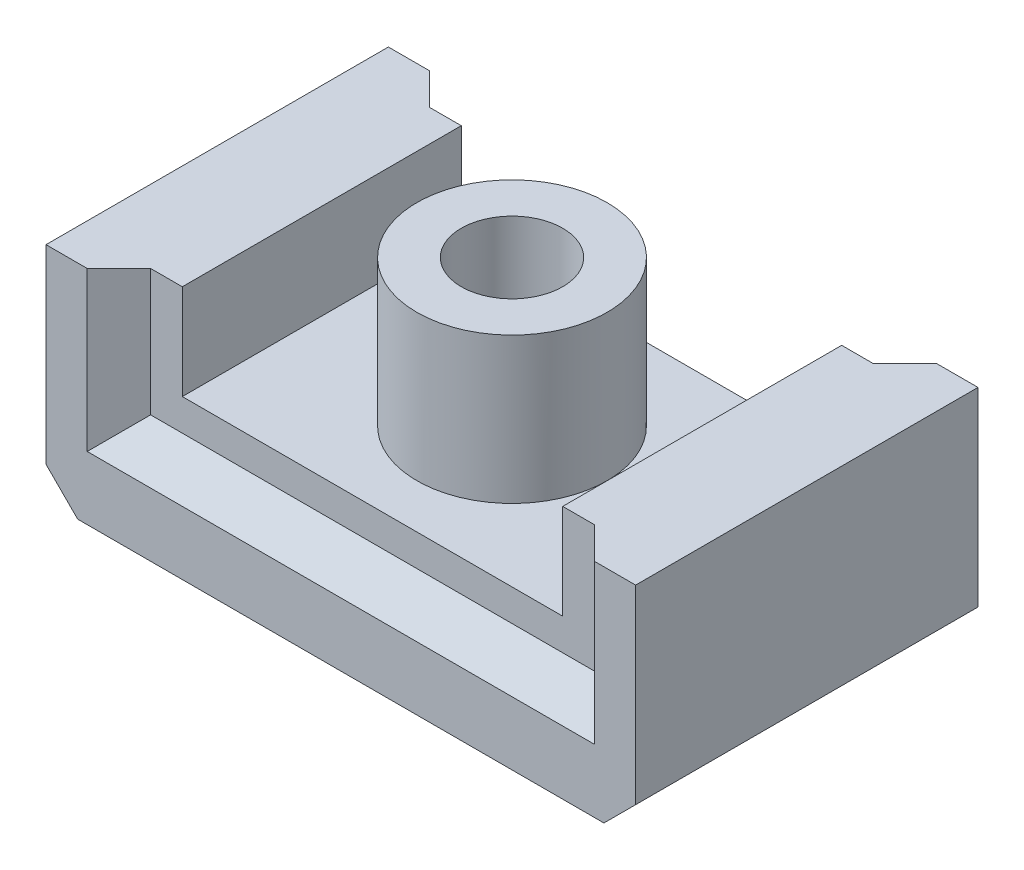
ISO-10303-21;
HEADER;
FILE_DESCRIPTION(('STEP AP214'),'2;1');
FILE_NAME('part.step','',(''),(''),'','','');
FILE_SCHEMA(('AUTOMOTIVE_DESIGN { 1 0 10303 214 1 1 1 1 }'));
ENDSEC;
DATA;
#1=APPLICATION_CONTEXT('core data for automotive mechanical design processes');
#2=APPLICATION_PROTOCOL_DEFINITION('international standard','automotive_design',2000,#1);
#3=PRODUCT_CONTEXT('',#1,'mechanical');
#4=PRODUCT('Part','Part','',(#3));
#5=PRODUCT_RELATED_PRODUCT_CATEGORY('part','',(#4));
#6=PRODUCT_DEFINITION_FORMATION('','',#4);
#7=PRODUCT_DEFINITION_CONTEXT('part definition',#1,'design');
#8=PRODUCT_DEFINITION('design','',#6,#7);
#9=PRODUCT_DEFINITION_SHAPE('','',#8);
#10=(LENGTH_UNIT() NAMED_UNIT(*) SI_UNIT(.MILLI.,.METRE.));
#11=(NAMED_UNIT(*) PLANE_ANGLE_UNIT() SI_UNIT($,.RADIAN.));
#12=(NAMED_UNIT(*) SI_UNIT($,.STERADIAN.) SOLID_ANGLE_UNIT());
#13=UNCERTAINTY_MEASURE_WITH_UNIT(LENGTH_MEASURE(1.E-05),#10,'distance_accuracy_value','');
#14=(GEOMETRIC_REPRESENTATION_CONTEXT(3) GLOBAL_UNCERTAINTY_ASSIGNED_CONTEXT((#13)) GLOBAL_UNIT_ASSIGNED_CONTEXT((#10,
#11,#12)) REPRESENTATION_CONTEXT('',''));
#15=CARTESIAN_POINT('',(0.,0.,0.));
#16=DIRECTION('',(0.,0.,1.));
#17=DIRECTION('',(1.,0.,0.));
#18=AXIS2_PLACEMENT_3D('',#15,#16,#17);
#19=CARTESIAN_POINT('',(15.3,7.,10.8));
#20=DIRECTION('',(1.,0.,0.));
#21=DIRECTION('',(0.,0.,-1.));
#22=AXIS2_PLACEMENT_3D('',#19,#20,#21);
#23=PLANE('',#22);
#24=DIRECTION('',(0.,-1.,0.));
#25=VECTOR('',#24,1.);
#26=CARTESIAN_POINT('',(15.3,7.,9.8));
#27=LINE('',#26,#25);
#28=CARTESIAN_POINT('',(15.3,7.,9.8));
#29=VERTEX_POINT('',#28);
#30=CARTESIAN_POINT('',(15.3,4.,9.8));
#31=VERTEX_POINT('',#30);
#32=EDGE_CURVE('E193',#29,#31,#27,.T.);
#33=ORIENTED_EDGE('',*,*,#32,.F.);
#34=DIRECTION('',(0.,0.,-1.));
#35=VECTOR('',#34,1.);
#36=CARTESIAN_POINT('',(15.3,7.,10.8));
#37=LINE('',#36,#35);
#38=CARTESIAN_POINT('',(15.3,7.,1.));
#39=VERTEX_POINT('',#38);
#40=EDGE_CURVE('E258',#29,#39,#37,.T.);
#41=ORIENTED_EDGE('',*,*,#40,.T.);
#42=DIRECTION('',(0.,1.,0.));
#43=VECTOR('',#42,1.);
#44=CARTESIAN_POINT('',(15.3,7.,1.));
#45=LINE('',#44,#43);
#46=CARTESIAN_POINT('',(15.3,4.,1.));
#47=VERTEX_POINT('',#46);
#48=EDGE_CURVE('E216',#47,#39,#45,.T.);
#49=ORIENTED_EDGE('',*,*,#48,.F.);
#50=DIRECTION('',(0.,0.,-1.));
#51=VECTOR('',#50,1.);
#52=CARTESIAN_POINT('',(15.3,4.,10.8));
#53=LINE('',#52,#51);
#54=EDGE_CURVE('E256',#31,#47,#53,.T.);
#55=ORIENTED_EDGE('',*,*,#54,.F.);
#56=EDGE_LOOP('',(#33,#41,#49,#55));
#57=FACE_BOUND('',#56,.T.);
#58=ADVANCED_FACE('F33',(#57),#23,.F.);
#59=CARTESIAN_POINT('',(15.3,4.,10.8));
#60=DIRECTION('',(0.,-1.,0.));
#61=DIRECTION('',(0.,0.,-1.));
#62=AXIS2_PLACEMENT_3D('',#59,#60,#61);
#63=PLANE('',#62);
#64=CARTESIAN_POINT('',(9.3,4.,5.4));
#65=DIRECTION('',(0.,-1.,0.));
#66=DIRECTION('',(0.,0.,-1.));
#67=AXIS2_PLACEMENT_3D('',#64,#65,#66);
#68=CIRCLE('',#67,3.);
#69=CARTESIAN_POINT('',(9.3,4.,2.4));
#70=VERTEX_POINT('',#69);
#71=EDGE_CURVE('E262',#70,#70,#68,.F.);
#72=ORIENTED_EDGE('',*,*,#71,.F.);
#73=EDGE_LOOP('',(#72));
#74=FACE_BOUND('',#73,.T.);
#75=DIRECTION('',(-1.,0.,0.));
#76=VECTOR('',#75,1.);
#77=CARTESIAN_POINT('',(15.3,4.,9.8));
#78=LINE('',#77,#76);
#79=CARTESIAN_POINT('',(3.3,4.,9.8));
#80=VERTEX_POINT('',#79);
#81=EDGE_CURVE('E191',#31,#80,#78,.T.);
#82=ORIENTED_EDGE('',*,*,#81,.F.);
#83=ORIENTED_EDGE('',*,*,#54,.T.);
#84=DIRECTION('',(1.,0.,0.));
#85=VECTOR('',#84,1.);
#86=CARTESIAN_POINT('',(15.3,4.,1.));
#87=LINE('',#86,#85);
#88=CARTESIAN_POINT('',(3.3,4.,1.));
#89=VERTEX_POINT('',#88);
#90=EDGE_CURVE('E213',#89,#47,#87,.T.);
#91=ORIENTED_EDGE('',*,*,#90,.F.);
#92=DIRECTION('',(0.,0.,-1.));
#93=VECTOR('',#92,1.);
#94=CARTESIAN_POINT('',(3.3,4.,10.8));
#95=LINE('',#94,#93);
#96=EDGE_CURVE('E254',#80,#89,#95,.T.);
#97=ORIENTED_EDGE('',*,*,#96,.F.);
#98=EDGE_LOOP('',(#82,#83,#91,#97));
#99=FACE_BOUND('',#98,.T.);
#100=ADVANCED_FACE('F362',(#74,#99),#63,.F.);
#101=CARTESIAN_POINT('',(3.3,4.,10.8));
#102=DIRECTION('',(-1.,0.,0.));
#103=DIRECTION('',(0.,0.,1.));
#104=AXIS2_PLACEMENT_3D('',#101,#102,#103);
#105=PLANE('',#104);
#106=DIRECTION('',(0.,1.,0.));
#107=VECTOR('',#106,1.);
#108=CARTESIAN_POINT('',(3.3,4.,9.8));
#109=LINE('',#108,#107);
#110=CARTESIAN_POINT('',(3.3,7.,9.8));
#111=VERTEX_POINT('',#110);
#112=EDGE_CURVE('E188',#80,#111,#109,.T.);
#113=ORIENTED_EDGE('',*,*,#112,.F.);
#114=ORIENTED_EDGE('',*,*,#96,.T.);
#115=DIRECTION('',(0.,-1.,0.));
#116=VECTOR('',#115,1.);
#117=CARTESIAN_POINT('',(3.3,4.,1.));
#118=LINE('',#117,#116);
#119=CARTESIAN_POINT('',(3.3,7.,1.));
#120=VERTEX_POINT('',#119);
#121=EDGE_CURVE('E199',#120,#89,#118,.T.);
#122=ORIENTED_EDGE('',*,*,#121,.F.);
#123=DIRECTION('',(0.,0.,-1.));
#124=VECTOR('',#123,1.);
#125=CARTESIAN_POINT('',(3.3,7.,10.8));
#126=LINE('',#125,#124);
#127=EDGE_CURVE('E252',#111,#120,#126,.T.);
#128=ORIENTED_EDGE('',*,*,#127,.F.);
#129=EDGE_LOOP('',(#113,#114,#122,#128));
#130=FACE_BOUND('',#129,.T.);
#131=ADVANCED_FACE('F366',(#130),#105,.F.);
#132=CARTESIAN_POINT('',(18.6,7.,10.8));
#133=DIRECTION('',(0.,-1.,0.));
#134=DIRECTION('',(0.,0.,-1.));
#135=AXIS2_PLACEMENT_3D('',#132,#133,#134);
#136=PLANE('',#135);
#137=DIRECTION('',(1.,0.,0.));
#138=VECTOR('',#137,1.);
#139=CARTESIAN_POINT('',(17.3,7.,9.8));
#140=LINE('',#139,#138);
#141=CARTESIAN_POINT('',(16.3,7.,9.8));
#142=VERTEX_POINT('',#141);
#143=EDGE_CURVE('E164',#29,#142,#140,.T.);
#144=ORIENTED_EDGE('',*,*,#143,.T.);
#145=DIRECTION('',(-0.707106781186551,0.,-0.707106781186544));
#146=VECTOR('',#145,1.);
#147=CARTESIAN_POINT('',(17.95,7.,11.45));
#148=LINE('',#147,#146);
#149=CARTESIAN_POINT('',(17.3,7.,10.8));
#150=VERTEX_POINT('',#149);
#151=EDGE_CURVE('E11',#142,#150,#148,.F.);
#152=ORIENTED_EDGE('',*,*,#151,.T.);
#153=DIRECTION('',(-1.,0.,0.));
#154=VECTOR('',#153,1.);
#155=CARTESIAN_POINT('',(18.6,7.,10.8));
#156=LINE('',#155,#154);
#157=CARTESIAN_POINT('',(18.6,7.,10.8));
#158=VERTEX_POINT('',#157);
#159=EDGE_CURVE('E162',#158,#150,#156,.T.);
#160=ORIENTED_EDGE('',*,*,#159,.F.);
#161=DIRECTION('',(0.,0.,-1.));
#162=VECTOR('',#161,1.);
#163=CARTESIAN_POINT('',(18.6,7.,10.8));
#164=LINE('',#163,#162);
#165=CARTESIAN_POINT('',(18.6,7.,0.));
#166=VERTEX_POINT('',#165);
#167=EDGE_CURVE('E260',#158,#166,#164,.T.);
#168=ORIENTED_EDGE('',*,*,#167,.T.);
#169=DIRECTION('',(-1.,0.,0.));
#170=VECTOR('',#169,1.);
#171=CARTESIAN_POINT('',(18.6,7.,0.));
#172=LINE('',#171,#170);
#173=CARTESIAN_POINT('',(17.3,7.,0.));
#174=VERTEX_POINT('',#173);
#175=EDGE_CURVE('E246',#166,#174,#172,.T.);
#176=ORIENTED_EDGE('',*,*,#175,.T.);
#177=DIRECTION('',(-0.707106781186551,0.,0.707106781186544));
#178=VECTOR('',#177,1.);
#179=CARTESIAN_POINT('',(12.55,7.,4.74999999999995));
#180=LINE('',#179,#178);
#181=CARTESIAN_POINT('',(16.3,7.,1.));
#182=VERTEX_POINT('',#181);
#183=EDGE_CURVE('E292',#174,#182,#180,.T.);
#184=ORIENTED_EDGE('',*,*,#183,.T.);
#185=DIRECTION('',(1.,0.,0.));
#186=VECTOR('',#185,1.);
#187=CARTESIAN_POINT('',(17.3,7.,1.));
#188=LINE('',#187,#186);
#189=EDGE_CURVE('E200',#39,#182,#188,.T.);
#190=ORIENTED_EDGE('',*,*,#189,.F.);
#191=ORIENTED_EDGE('',*,*,#40,.F.);
#192=EDGE_LOOP('',(#144,#152,#160,#168,#176,#184,#190,#191));
#193=FACE_BOUND('',#192,.T.);
#194=ADVANCED_FACE('F160',(#193),#136,.F.);
#195=CARTESIAN_POINT('',(3.3,7.,10.8));
#196=DIRECTION('',(0.,-1.,0.));
#197=DIRECTION('',(0.,0.,-1.));
#198=AXIS2_PLACEMENT_3D('',#195,#196,#197);
#199=PLANE('',#198);
#200=DIRECTION('',(-1.,0.,0.));
#201=VECTOR('',#200,1.);
#202=CARTESIAN_POINT('',(3.3,7.,10.8));
#203=LINE('',#202,#201);
#204=CARTESIAN_POINT('',(1.3,7.,10.8));
#205=VERTEX_POINT('',#204);
#206=CARTESIAN_POINT('',(0.,7.,10.8));
#207=VERTEX_POINT('',#206);
#208=EDGE_CURVE('E174',#205,#207,#203,.T.);
#209=ORIENTED_EDGE('',*,*,#208,.F.);
#210=DIRECTION('',(-0.707106781186551,0.,0.707106781186544));
#211=VECTOR('',#210,1.);
#212=CARTESIAN_POINT('',(2.30000000000001,7.,9.8));
#213=LINE('',#212,#211);
#214=CARTESIAN_POINT('',(2.30000000000001,7.,9.8));
#215=VERTEX_POINT('',#214);
#216=EDGE_CURVE('E42',#205,#215,#213,.F.);
#217=ORIENTED_EDGE('',*,*,#216,.T.);
#218=EDGE_CURVE('E185',#215,#111,#140,.T.);
#219=ORIENTED_EDGE('',*,*,#218,.T.);
#220=ORIENTED_EDGE('',*,*,#127,.T.);
#221=CARTESIAN_POINT('',(2.30000000000001,7.,1.));
#222=VERTEX_POINT('',#221);
#223=EDGE_CURVE('E196',#222,#120,#188,.T.);
#224=ORIENTED_EDGE('',*,*,#223,.F.);
#225=DIRECTION('',(-0.707106781186551,0.,-0.707106781186544));
#226=VECTOR('',#225,1.);
#227=CARTESIAN_POINT('',(7.70000000000001,7.,6.39999999999995));
#228=LINE('',#227,#226);
#229=CARTESIAN_POINT('',(1.3,7.,0.));
#230=VERTEX_POINT('',#229);
#231=EDGE_CURVE('E290',#222,#230,#228,.T.);
#232=ORIENTED_EDGE('',*,*,#231,.T.);
#233=DIRECTION('',(-1.,0.,0.));
#234=VECTOR('',#233,1.);
#235=CARTESIAN_POINT('',(3.3,7.,0.));
#236=LINE('',#235,#234);
#237=CARTESIAN_POINT('',(0.,7.,0.));
#238=VERTEX_POINT('',#237);
#239=EDGE_CURVE('E233',#230,#238,#236,.T.);
#240=ORIENTED_EDGE('',*,*,#239,.T.);
#241=DIRECTION('',(0.,0.,-1.));
#242=VECTOR('',#241,1.);
#243=CARTESIAN_POINT('',(0.,7.,10.8));
#244=LINE('',#243,#242);
#245=EDGE_CURVE('E238',#207,#238,#244,.T.);
#246=ORIENTED_EDGE('',*,*,#245,.F.);
#247=EDGE_LOOP('',(#209,#217,#219,#220,#224,#232,#240,#246));
#248=FACE_BOUND('',#247,.T.);
#249=ADVANCED_FACE('F312',(#248),#199,.F.);
#250=CARTESIAN_POINT('',(0.,0.,10.8));
#251=DIRECTION('',(0.,0.,1.));
#252=DIRECTION('',(1.,0.,0.));
#253=AXIS2_PLACEMENT_3D('',#250,#251,#252);
#254=PLANE('',#253);
#255=ORIENTED_EDGE('',*,*,#159,.T.);
#256=DIRECTION('',(0.,-1.,0.));
#257=VECTOR('',#256,1.);
#258=CARTESIAN_POINT('',(17.3,7.,10.8));
#259=LINE('',#258,#257);
#260=CARTESIAN_POINT('',(17.3,2.,10.8));
#261=VERTEX_POINT('',#260);
#262=EDGE_CURVE('E169',#150,#261,#259,.T.);
#263=ORIENTED_EDGE('',*,*,#262,.T.);
#264=DIRECTION('',(-1.,0.,0.));
#265=VECTOR('',#264,1.);
#266=CARTESIAN_POINT('',(17.3,2.,10.8));
#267=LINE('',#266,#265);
#268=CARTESIAN_POINT('',(1.3,2.,10.8));
#269=VERTEX_POINT('',#268);
#270=EDGE_CURVE('E181',#261,#269,#267,.T.);
#271=ORIENTED_EDGE('',*,*,#270,.T.);
#272=DIRECTION('',(0.,1.,0.));
#273=VECTOR('',#272,1.);
#274=CARTESIAN_POINT('',(1.3,7.,10.8));
#275=LINE('',#274,#273);
#276=EDGE_CURVE('E178',#269,#205,#275,.T.);
#277=ORIENTED_EDGE('',*,*,#276,.T.);
#278=ORIENTED_EDGE('',*,*,#208,.T.);
#279=DIRECTION('',(0.,-1.,0.));
#280=VECTOR('',#279,1.);
#281=CARTESIAN_POINT('',(0.,7.,10.8));
#282=LINE('',#281,#280);
#283=CARTESIAN_POINT('',(0.,1.00000000000001,10.8));
#284=VERTEX_POINT('',#283);
#285=EDGE_CURVE('E229',#207,#284,#282,.T.);
#286=ORIENTED_EDGE('',*,*,#285,.T.);
#287=DIRECTION('',(-0.707106781186546,0.707106781186549,0.));
#288=VECTOR('',#287,1.);
#289=CARTESIAN_POINT('',(0.500000000000004,0.500000000000002,10.8));
#290=LINE('',#289,#288);
#291=CARTESIAN_POINT('',(1.,0.,10.8));
#292=VERTEX_POINT('',#291);
#293=EDGE_CURVE('E278',#284,#292,#290,.F.);
#294=ORIENTED_EDGE('',*,*,#293,.T.);
#295=DIRECTION('',(1.,0.,0.));
#296=VECTOR('',#295,1.);
#297=CARTESIAN_POINT('',(0.,0.,10.8));
#298=LINE('',#297,#296);
#299=CARTESIAN_POINT('',(17.6,0.,10.8));
#300=VERTEX_POINT('',#299);
#301=EDGE_CURVE('E232',#292,#300,#298,.T.);
#302=ORIENTED_EDGE('',*,*,#301,.T.);
#303=DIRECTION('',(-0.707106781186551,-0.707106781186544,0.));
#304=VECTOR('',#303,1.);
#305=CARTESIAN_POINT('',(8.7999999999999,-8.8,10.8));
#306=LINE('',#305,#304);
#307=CARTESIAN_POINT('',(18.6,0.999999999999996,10.8));
#308=VERTEX_POINT('',#307);
#309=EDGE_CURVE('E276',#300,#308,#306,.F.);
#310=ORIENTED_EDGE('',*,*,#309,.T.);
#311=DIRECTION('',(0.,1.,0.));
#312=VECTOR('',#311,1.);
#313=CARTESIAN_POINT('',(18.6,0.,10.8));
#314=LINE('',#313,#312);
#315=EDGE_CURVE('E172',#308,#158,#314,.T.);
#316=ORIENTED_EDGE('',*,*,#315,.T.);
#317=EDGE_LOOP('',(#255,#263,#271,#277,#278,#286,#294,#302,#310,#316));
#318=FACE_BOUND('',#317,.T.);
#319=ADVANCED_FACE('F168',(#318),#254,.T.);
#320=CARTESIAN_POINT('',(0.,7.,10.8));
#321=DIRECTION('',(1.,0.,0.));
#322=DIRECTION('',(0.,1.,0.));
#323=AXIS2_PLACEMENT_3D('',#320,#321,#322);
#324=PLANE('',#323);
#325=DIRECTION('',(0.,-1.,0.));
#326=VECTOR('',#325,1.);
#327=CARTESIAN_POINT('',(0.,7.,0.));
#328=LINE('',#327,#326);
#329=CARTESIAN_POINT('',(0.,1.00000000000001,0.));
#330=VERTEX_POINT('',#329);
#331=EDGE_CURVE('E228',#238,#330,#328,.T.);
#332=ORIENTED_EDGE('',*,*,#331,.T.);
#333=DIRECTION('',(0.,0.,1.));
#334=VECTOR('',#333,1.);
#335=CARTESIAN_POINT('',(0.,1.00000000000001,10.8));
#336=LINE('',#335,#334);
#337=EDGE_CURVE('E274',#330,#284,#336,.T.);
#338=ORIENTED_EDGE('',*,*,#337,.T.);
#339=ORIENTED_EDGE('',*,*,#285,.F.);
#340=ORIENTED_EDGE('',*,*,#245,.T.);
#341=EDGE_LOOP('',(#332,#338,#339,#340));
#342=FACE_BOUND('',#341,.T.);
#343=ADVANCED_FACE('F317',(#342),#324,.F.);
#344=CARTESIAN_POINT('',(0.,0.,10.8));
#345=DIRECTION('',(0.,1.,0.));
#346=DIRECTION('',(0.,0.,1.));
#347=AXIS2_PLACEMENT_3D('',#344,#345,#346);
#348=PLANE('',#347);
#349=CARTESIAN_POINT('',(9.3,0.,5.4));
#350=DIRECTION('',(0.,1.,0.));
#351=DIRECTION('',(0.,0.,1.));
#352=AXIS2_PLACEMENT_3D('',#349,#350,#351);
#353=CIRCLE('',#352,1.6);
#354=CARTESIAN_POINT('',(9.3,0.,7.));
#355=VERTEX_POINT('',#354);
#356=EDGE_CURVE('E220',#355,#355,#353,.T.);
#357=ORIENTED_EDGE('',*,*,#356,.T.);
#358=EDGE_LOOP('',(#357));
#359=FACE_BOUND('',#358,.T.);
#360=ORIENTED_EDGE('',*,*,#301,.F.);
#361=DIRECTION('',(0.,0.,-1.));
#362=VECTOR('',#361,1.);
#363=CARTESIAN_POINT('',(1.,0.,10.8));
#364=LINE('',#363,#362);
#365=CARTESIAN_POINT('',(1.,0.,0.));
#366=VERTEX_POINT('',#365);
#367=EDGE_CURVE('E267',#292,#366,#364,.T.);
#368=ORIENTED_EDGE('',*,*,#367,.T.);
#369=DIRECTION('',(1.,0.,0.));
#370=VECTOR('',#369,1.);
#371=CARTESIAN_POINT('',(0.,0.,0.));
#372=LINE('',#371,#370);
#373=CARTESIAN_POINT('',(17.6,0.,0.));
#374=VERTEX_POINT('',#373);
#375=EDGE_CURVE('E241',#366,#374,#372,.T.);
#376=ORIENTED_EDGE('',*,*,#375,.T.);
#377=DIRECTION('',(0.,0.,1.));
#378=VECTOR('',#377,1.);
#379=CARTESIAN_POINT('',(17.6,0.,10.8));
#380=LINE('',#379,#378);
#381=EDGE_CURVE('E265',#374,#300,#380,.T.);
#382=ORIENTED_EDGE('',*,*,#381,.T.);
#383=EDGE_LOOP('',(#360,#368,#376,#382));
#384=FACE_BOUND('',#383,.T.);
#385=ADVANCED_FACE('F326',(#359,#384),#348,.F.);
#386=CARTESIAN_POINT('',(18.6,0.,10.8));
#387=DIRECTION('',(-1.,0.,0.));
#388=DIRECTION('',(0.,-1.,0.));
#389=AXIS2_PLACEMENT_3D('',#386,#387,#388);
#390=PLANE('',#389);
#391=ORIENTED_EDGE('',*,*,#315,.F.);
#392=DIRECTION('',(0.,0.,-1.));
#393=VECTOR('',#392,1.);
#394=CARTESIAN_POINT('',(18.6,0.999999999999996,10.8));
#395=LINE('',#394,#393);
#396=CARTESIAN_POINT('',(18.6,0.999999999999996,0.));
#397=VERTEX_POINT('',#396);
#398=EDGE_CURVE('E280',#308,#397,#395,.T.);
#399=ORIENTED_EDGE('',*,*,#398,.T.);
#400=DIRECTION('',(0.,1.,0.));
#401=VECTOR('',#400,1.);
#402=CARTESIAN_POINT('',(18.6,0.,0.));
#403=LINE('',#402,#401);
#404=EDGE_CURVE('E244',#397,#166,#403,.T.);
#405=ORIENTED_EDGE('',*,*,#404,.T.);
#406=ORIENTED_EDGE('',*,*,#167,.F.);
#407=EDGE_LOOP('',(#391,#399,#405,#406));
#408=FACE_BOUND('',#407,.T.);
#409=ADVANCED_FACE('F337',(#408),#390,.F.);
#410=CARTESIAN_POINT('',(0.,0.,0.));
#411=DIRECTION('',(0.,0.,1.));
#412=DIRECTION('',(1.,0.,0.));
#413=AXIS2_PLACEMENT_3D('',#410,#411,#412);
#414=PLANE('',#413);
#415=DIRECTION('',(-1.,0.,0.));
#416=VECTOR('',#415,1.);
#417=CARTESIAN_POINT('',(17.3,2.,0.));
#418=LINE('',#417,#416);
#419=CARTESIAN_POINT('',(17.3,2.,0.));
#420=VERTEX_POINT('',#419);
#421=CARTESIAN_POINT('',(1.3,2.,0.));
#422=VERTEX_POINT('',#421);
#423=EDGE_CURVE('E204',#420,#422,#418,.T.);
#424=ORIENTED_EDGE('',*,*,#423,.F.);
#425=DIRECTION('',(0.,-1.,0.));
#426=VECTOR('',#425,1.);
#427=CARTESIAN_POINT('',(17.3,7.,0.));
#428=LINE('',#427,#426);
#429=EDGE_CURVE('E201',#174,#420,#428,.T.);
#430=ORIENTED_EDGE('',*,*,#429,.F.);
#431=ORIENTED_EDGE('',*,*,#175,.F.);
#432=ORIENTED_EDGE('',*,*,#404,.F.);
#433=DIRECTION('',(0.707106781186551,0.707106781186544,0.));
#434=VECTOR('',#433,1.);
#435=CARTESIAN_POINT('',(18.6,0.999999999999997,0.));
#436=LINE('',#435,#434);
#437=EDGE_CURVE('E270',#397,#374,#436,.F.);
#438=ORIENTED_EDGE('',*,*,#437,.T.);
#439=ORIENTED_EDGE('',*,*,#375,.F.);
#440=DIRECTION('',(0.707106781186546,-0.707106781186549,0.));
#441=VECTOR('',#440,1.);
#442=CARTESIAN_POINT('',(1.,0.,0.));
#443=LINE('',#442,#441);
#444=EDGE_CURVE('E272',#366,#330,#443,.F.);
#445=ORIENTED_EDGE('',*,*,#444,.T.);
#446=ORIENTED_EDGE('',*,*,#331,.F.);
#447=ORIENTED_EDGE('',*,*,#239,.F.);
#448=DIRECTION('',(0.,1.,0.));
#449=VECTOR('',#448,1.);
#450=CARTESIAN_POINT('',(1.3,7.,0.));
#451=LINE('',#450,#449);
#452=EDGE_CURVE('E208',#422,#230,#451,.T.);
#453=ORIENTED_EDGE('',*,*,#452,.F.);
#454=EDGE_LOOP('',(#424,#430,#431,#432,#438,#439,#445,#446,#447,#453));
#455=FACE_BOUND('',#454,.T.);
#456=ADVANCED_FACE('F329',(#455),#414,.F.);
#457=CARTESIAN_POINT('',(9.3,8.6,5.4));
#458=DIRECTION('',(0.,-1.,0.));
#459=DIRECTION('',(0.,0.,-1.));
#460=AXIS2_PLACEMENT_3D('',#457,#458,#459);
#461=CYLINDRICAL_SURFACE('',#460,3.);
#462=CARTESIAN_POINT('',(9.3,8.6,5.4));
#463=DIRECTION('',(0.,1.,0.));
#464=DIRECTION('',(0.,0.,1.));
#465=AXIS2_PLACEMENT_3D('',#462,#463,#464);
#466=CIRCLE('',#465,3.);
#467=CARTESIAN_POINT('',(9.3,8.6,8.4));
#468=VERTEX_POINT('',#467);
#469=EDGE_CURVE('E223',#468,#468,#466,.T.);
#470=ORIENTED_EDGE('',*,*,#469,.F.);
#471=EDGE_LOOP('',(#470));
#472=FACE_BOUND('',#471,.T.);
#473=ORIENTED_EDGE('',*,*,#71,.T.);
#474=EDGE_LOOP('',(#473));
#475=FACE_BOUND('',#474,.T.);
#476=ADVANCED_FACE('F415',(#472,#475),#461,.T.);
#477=CARTESIAN_POINT('',(9.3,8.6,5.4));
#478=DIRECTION('',(0.,1.,0.));
#479=DIRECTION('',(0.,0.,1.));
#480=AXIS2_PLACEMENT_3D('',#477,#478,#479);
#481=PLANE('',#480);
#482=CARTESIAN_POINT('',(9.3,8.6,5.4));
#483=DIRECTION('',(0.,1.,0.));
#484=DIRECTION('',(0.,0.,1.));
#485=AXIS2_PLACEMENT_3D('',#482,#483,#484);
#486=CIRCLE('',#485,1.6);
#487=CARTESIAN_POINT('',(9.3,8.6,7.));
#488=VERTEX_POINT('',#487);
#489=EDGE_CURVE('E219',#488,#488,#486,.T.);
#490=ORIENTED_EDGE('',*,*,#489,.F.);
#491=EDGE_LOOP('',(#490));
#492=FACE_BOUND('',#491,.T.);
#493=ORIENTED_EDGE('',*,*,#469,.T.);
#494=EDGE_LOOP('',(#493));
#495=FACE_BOUND('',#494,.T.);
#496=ADVANCED_FACE('F411',(#492,#495),#481,.T.);
#497=CARTESIAN_POINT('',(9.3,0.,5.4));
#498=DIRECTION('',(0.,1.,0.));
#499=DIRECTION('',(0.,0.,1.));
#500=AXIS2_PLACEMENT_3D('',#497,#498,#499);
#501=CYLINDRICAL_SURFACE('',#500,1.6);
#502=CARTESIAN_POINT('',(9.3,0.,7.));
#503=CARTESIAN_POINT('',(9.3,0.0895833333333332,7.));
#504=CARTESIAN_POINT('',(9.3,0.179166666666667,7.));
#505=CARTESIAN_POINT('',(9.3,0.358333333333333,7.));
#506=CARTESIAN_POINT('',(9.3,0.447916666666667,7.));
#507=CARTESIAN_POINT('',(9.3,0.627083333333333,7.));
#508=CARTESIAN_POINT('',(9.3,0.716666666666667,7.));
#509=CARTESIAN_POINT('',(9.3,0.895833333333333,7.));
#510=CARTESIAN_POINT('',(9.3,0.985416666666667,7.));
#511=CARTESIAN_POINT('',(9.3,1.16458333333333,7.));
#512=CARTESIAN_POINT('',(9.3,1.25416666666667,7.));
#513=CARTESIAN_POINT('',(9.3,1.43333333333333,7.));
#514=CARTESIAN_POINT('',(9.3,1.52291666666667,7.));
#515=CARTESIAN_POINT('',(9.3,1.70208333333333,7.));
#516=CARTESIAN_POINT('',(9.3,1.79166666666667,7.));
#517=CARTESIAN_POINT('',(9.3,1.97083333333333,7.));
#518=CARTESIAN_POINT('',(9.3,2.06041666666667,7.));
#519=CARTESIAN_POINT('',(9.3,2.23958333333333,7.));
#520=CARTESIAN_POINT('',(9.3,2.32916666666667,7.));
#521=CARTESIAN_POINT('',(9.3,2.50833333333333,7.));
#522=CARTESIAN_POINT('',(9.3,2.59791666666667,7.));
#523=CARTESIAN_POINT('',(9.3,2.77708333333333,7.));
#524=CARTESIAN_POINT('',(9.3,2.86666666666667,7.));
#525=CARTESIAN_POINT('',(9.3,3.04583333333333,7.));
#526=CARTESIAN_POINT('',(9.3,3.13541666666667,7.));
#527=CARTESIAN_POINT('',(9.3,3.31458333333333,7.));
#528=CARTESIAN_POINT('',(9.3,3.40416666666667,7.));
#529=CARTESIAN_POINT('',(9.3,3.58333333333333,7.));
#530=CARTESIAN_POINT('',(9.3,3.67291666666667,7.));
#531=CARTESIAN_POINT('',(9.3,3.85208333333333,7.));
#532=CARTESIAN_POINT('',(9.3,3.94166666666667,7.));
#533=CARTESIAN_POINT('',(9.3,4.12083333333333,7.));
#534=CARTESIAN_POINT('',(9.3,4.21041666666667,7.));
#535=CARTESIAN_POINT('',(9.3,4.38958333333333,7.));
#536=CARTESIAN_POINT('',(9.3,4.47916666666667,7.));
#537=CARTESIAN_POINT('',(9.3,4.65833333333333,7.));
#538=CARTESIAN_POINT('',(9.3,4.74791666666667,7.));
#539=CARTESIAN_POINT('',(9.3,4.92708333333333,7.));
#540=CARTESIAN_POINT('',(9.3,5.01666666666667,7.));
#541=CARTESIAN_POINT('',(9.3,5.19583333333333,7.));
#542=CARTESIAN_POINT('',(9.3,5.28541666666667,7.));
#543=CARTESIAN_POINT('',(9.3,5.46458333333333,7.));
#544=CARTESIAN_POINT('',(9.3,5.55416666666667,7.));
#545=CARTESIAN_POINT('',(9.3,5.73333333333333,7.));
#546=CARTESIAN_POINT('',(9.3,5.82291666666667,7.));
#547=CARTESIAN_POINT('',(9.3,6.00208333333333,7.));
#548=CARTESIAN_POINT('',(9.3,6.09166666666667,7.));
#549=CARTESIAN_POINT('',(9.3,6.27083333333333,7.));
#550=CARTESIAN_POINT('',(9.3,6.36041666666667,7.));
#551=CARTESIAN_POINT('',(9.3,6.53958333333333,7.));
#552=CARTESIAN_POINT('',(9.3,6.62916666666667,7.));
#553=CARTESIAN_POINT('',(9.3,6.80833333333333,7.));
#554=CARTESIAN_POINT('',(9.3,6.89791666666667,7.));
#555=CARTESIAN_POINT('',(9.3,7.07708333333333,7.));
#556=CARTESIAN_POINT('',(9.3,7.16666666666667,7.));
#557=CARTESIAN_POINT('',(9.3,7.34583333333333,7.));
#558=CARTESIAN_POINT('',(9.3,7.43541666666667,7.));
#559=CARTESIAN_POINT('',(9.3,7.61458333333333,7.));
#560=CARTESIAN_POINT('',(9.3,7.70416666666667,7.));
#561=CARTESIAN_POINT('',(9.3,7.88333333333333,7.));
#562=CARTESIAN_POINT('',(9.3,7.97291666666667,7.));
#563=CARTESIAN_POINT('',(9.3,8.15208333333333,7.));
#564=CARTESIAN_POINT('',(9.3,8.24166666666667,7.));
#565=CARTESIAN_POINT('',(9.3,8.42083333333333,7.));
#566=CARTESIAN_POINT('',(9.3,8.51041666666666,7.));
#567=CARTESIAN_POINT('',(9.3,8.6,7.));
#568=B_SPLINE_CURVE_WITH_KNOTS('',3,(#502,#503,#504,#505,#506,#507,#508,#509,#510,#511,#512,
#513,#514,#515,#516,#517,#518,#519,#520,#521,#522,#523,#524,#525,#526,#527,#528,#529,#530,#531,
#532,#533,#534,#535,#536,#537,#538,#539,#540,#541,#542,#543,#544,#545,#546,#547,#548,#549,#550,
#551,#552,#553,#554,#555,#556,#557,#558,#559,#560,#561,#562,#563,#564,#565,#566,#567),
.UNSPECIFIED.,.F.,.F.,(4,2,2,2,2,2,2,2,2,2,2,2,2,2,2,2,2,2,2,2,2,2,2,2,2,2,2,2,2,2,2,2,4),(0.,
0.26875,0.5375,0.80625,1.075,1.34375,1.6125,1.88125,2.15,2.41875,2.6875,2.95625,3.225,3.49375,
3.7625,4.03125,4.3,4.56875,4.8375,5.10625,5.375,5.64375,5.9125,6.18125,6.45,6.71875,6.9875,
7.25625,7.525,7.79375,8.0625,8.33125,8.6),.UNSPECIFIED.);
#569=EDGE_CURVE('BSEAM398',#355,#488,#568,.T.);
#570=ORIENTED_EDGE('',*,*,#356,.F.);
#571=ORIENTED_EDGE('',*,*,#489,.T.);
#572=ORIENTED_EDGE('',*,*,#569,.T.);
#573=ORIENTED_EDGE('',*,*,#569,.F.);
#574=EDGE_LOOP('',(#570,#572,#571,#573));
#575=FACE_BOUND('',#574,.T.);
#576=ADVANCED_FACE('F398',(#575),#501,.F.);
#577=CARTESIAN_POINT('',(1.,0.,10.8));
#578=DIRECTION('',(0.707106781186549,0.707106781186546,0.));
#579=DIRECTION('',(0.,0.,-1.));
#580=AXIS2_PLACEMENT_3D('',#577,#578,#579);
#581=PLANE('',#580);
#582=ORIENTED_EDGE('',*,*,#293,.F.);
#583=ORIENTED_EDGE('',*,*,#337,.F.);
#584=ORIENTED_EDGE('',*,*,#444,.F.);
#585=ORIENTED_EDGE('',*,*,#367,.F.);
#586=EDGE_LOOP('',(#582,#583,#584,#585));
#587=FACE_BOUND('',#586,.T.);
#588=ADVANCED_FACE('F323',(#587),#581,.F.);
#589=CARTESIAN_POINT('',(18.6,0.999999999999997,10.8));
#590=DIRECTION('',(-0.707106781186544,0.707106781186552,0.));
#591=DIRECTION('',(0.,0.,-1.));
#592=AXIS2_PLACEMENT_3D('',#589,#590,#591);
#593=PLANE('',#592);
#594=ORIENTED_EDGE('',*,*,#309,.F.);
#595=ORIENTED_EDGE('',*,*,#381,.F.);
#596=ORIENTED_EDGE('',*,*,#437,.F.);
#597=ORIENTED_EDGE('',*,*,#398,.F.);
#598=EDGE_LOOP('',(#594,#595,#596,#597));
#599=FACE_BOUND('',#598,.T.);
#600=ADVANCED_FACE('F335',(#599),#593,.F.);
#601=CARTESIAN_POINT('',(0.,0.,1.));
#602=DIRECTION('',(0.,0.,-1.));
#603=DIRECTION('',(-1.,0.,0.));
#604=AXIS2_PLACEMENT_3D('',#601,#602,#603);
#605=PLANE('',#604);
#606=DIRECTION('',(-1.,0.,0.));
#607=VECTOR('',#606,1.);
#608=CARTESIAN_POINT('',(0.,3.00000000000001,1.));
#609=LINE('',#608,#607);
#610=CARTESIAN_POINT('',(16.3,3.00000000000001,1.));
#611=VERTEX_POINT('',#610);
#612=CARTESIAN_POINT('',(2.30000000000001,3.00000000000001,1.));
#613=VERTEX_POINT('',#612);
#614=EDGE_CURVE('E283',#611,#613,#609,.T.);
#615=ORIENTED_EDGE('',*,*,#614,.T.);
#616=DIRECTION('',(0.,1.,0.));
#617=VECTOR('',#616,1.);
#618=CARTESIAN_POINT('',(2.30000000000001,0.,1.));
#619=LINE('',#618,#617);
#620=EDGE_CURVE('E287',#613,#222,#619,.T.);
#621=ORIENTED_EDGE('',*,*,#620,.T.);
#622=ORIENTED_EDGE('',*,*,#223,.T.);
#623=ORIENTED_EDGE('',*,*,#121,.T.);
#624=ORIENTED_EDGE('',*,*,#90,.T.);
#625=ORIENTED_EDGE('',*,*,#48,.T.);
#626=ORIENTED_EDGE('',*,*,#189,.T.);
#627=DIRECTION('',(0.,-1.,0.));
#628=VECTOR('',#627,1.);
#629=CARTESIAN_POINT('',(16.3,0.,1.));
#630=LINE('',#629,#628);
#631=EDGE_CURVE('E285',#182,#611,#630,.T.);
#632=ORIENTED_EDGE('',*,*,#631,.T.);
#633=EDGE_LOOP('',(#615,#621,#622,#623,#624,#625,#626,#632));
#634=FACE_BOUND('',#633,.T.);
#635=ADVANCED_FACE('F349',(#634),#605,.T.);
#636=CARTESIAN_POINT('',(16.3,0.,1.));
#637=DIRECTION('',(0.707106781186544,0.,0.707106781186551));
#638=DIRECTION('',(0.,-1.,0.));
#639=AXIS2_PLACEMENT_3D('',#636,#637,#638);
#640=PLANE('',#639);
#641=ORIENTED_EDGE('',*,*,#183,.F.);
#642=ORIENTED_EDGE('',*,*,#429,.T.);
#643=DIRECTION('',(0.577350269189628,-0.577350269189628,-0.577350269189622));
#644=VECTOR('',#643,1.);
#645=CARTESIAN_POINT('',(17.3,2.,0.));
#646=LINE('',#645,#644);
#647=EDGE_CURVE('E205',#611,#420,#646,.T.);
#648=ORIENTED_EDGE('',*,*,#647,.F.);
#649=ORIENTED_EDGE('',*,*,#631,.F.);
#650=EDGE_LOOP('',(#641,#642,#648,#649));
#651=FACE_BOUND('',#650,.T.);
#652=ADVANCED_FACE('F341',(#651),#640,.F.);
#653=CARTESIAN_POINT('',(0.,3.00000000000001,1.));
#654=DIRECTION('',(0.,-0.707106781186544,0.707106781186551));
#655=DIRECTION('',(-1.,0.,0.));
#656=AXIS2_PLACEMENT_3D('',#653,#654,#655);
#657=PLANE('',#656);
#658=ORIENTED_EDGE('',*,*,#647,.T.);
#659=ORIENTED_EDGE('',*,*,#423,.T.);
#660=DIRECTION('',(0.577350269189628,0.577350269189628,0.577350269189622));
#661=VECTOR('',#660,1.);
#662=CARTESIAN_POINT('',(1.3,2.,0.));
#663=LINE('',#662,#661);
#664=EDGE_CURVE('E195',#613,#422,#663,.F.);
#665=ORIENTED_EDGE('',*,*,#664,.F.);
#666=ORIENTED_EDGE('',*,*,#614,.F.);
#667=EDGE_LOOP('',(#658,#659,#665,#666));
#668=FACE_BOUND('',#667,.T.);
#669=ADVANCED_FACE('F345',(#668),#657,.F.);
#670=CARTESIAN_POINT('',(2.30000000000001,0.,1.));
#671=DIRECTION('',(-0.707106781186544,0.,0.707106781186551));
#672=DIRECTION('',(0.,1.,0.));
#673=AXIS2_PLACEMENT_3D('',#670,#671,#672);
#674=PLANE('',#673);
#675=ORIENTED_EDGE('',*,*,#664,.T.);
#676=ORIENTED_EDGE('',*,*,#452,.T.);
#677=ORIENTED_EDGE('',*,*,#231,.F.);
#678=ORIENTED_EDGE('',*,*,#620,.F.);
#679=EDGE_LOOP('',(#675,#676,#677,#678));
#680=FACE_BOUND('',#679,.T.);
#681=ADVANCED_FACE('F369',(#680),#674,.F.);
#682=CARTESIAN_POINT('',(0.,0.,9.8));
#683=DIRECTION('',(0.,0.,1.));
#684=DIRECTION('',(-1.,0.,0.));
#685=AXIS2_PLACEMENT_3D('',#682,#683,#684);
#686=PLANE('',#685);
#687=ORIENTED_EDGE('',*,*,#218,.F.);
#688=DIRECTION('',(0.,-1.,0.));
#689=VECTOR('',#688,1.);
#690=CARTESIAN_POINT('',(2.30000000000001,2.,9.8));
#691=LINE('',#690,#689);
#692=CARTESIAN_POINT('',(2.30000000000001,3.00000000000001,9.8));
#693=VERTEX_POINT('',#692);
#694=EDGE_CURVE('E55',#215,#693,#691,.T.);
#695=ORIENTED_EDGE('',*,*,#694,.T.);
#696=DIRECTION('',(1.,0.,0.));
#697=VECTOR('',#696,1.);
#698=CARTESIAN_POINT('',(17.3,3.00000000000001,9.8));
#699=LINE('',#698,#697);
#700=CARTESIAN_POINT('',(16.3,3.00000000000001,9.8));
#701=VERTEX_POINT('',#700);
#702=EDGE_CURVE('E50',#693,#701,#699,.T.);
#703=ORIENTED_EDGE('',*,*,#702,.T.);
#704=DIRECTION('',(0.,1.,0.));
#705=VECTOR('',#704,1.);
#706=CARTESIAN_POINT('',(16.3,7.,9.8));
#707=LINE('',#706,#705);
#708=EDGE_CURVE('E299',#701,#142,#707,.T.);
#709=ORIENTED_EDGE('',*,*,#708,.T.);
#710=ORIENTED_EDGE('',*,*,#143,.F.);
#711=ORIENTED_EDGE('',*,*,#32,.T.);
#712=ORIENTED_EDGE('',*,*,#81,.T.);
#713=ORIENTED_EDGE('',*,*,#112,.T.);
#714=EDGE_LOOP('',(#687,#695,#703,#709,#710,#711,#712,#713));
#715=FACE_BOUND('',#714,.T.);
#716=ADVANCED_FACE('F358',(#715),#686,.T.);
#717=CARTESIAN_POINT('',(17.3,7.,10.8));
#718=DIRECTION('',(-0.707106781186544,0.,0.707106781186551));
#719=DIRECTION('',(0.,1.,0.));
#720=AXIS2_PLACEMENT_3D('',#717,#718,#719);
#721=PLANE('',#720);
#722=ORIENTED_EDGE('',*,*,#151,.F.);
#723=ORIENTED_EDGE('',*,*,#708,.F.);
#724=DIRECTION('',(-0.577350269189628,0.577350269189628,-0.577350269189622));
#725=VECTOR('',#724,1.);
#726=CARTESIAN_POINT('',(15.6333333333333,3.66666666666668,9.13333333333334));
#727=LINE('',#726,#725);
#728=EDGE_CURVE('E37',#261,#701,#727,.T.);
#729=ORIENTED_EDGE('',*,*,#728,.F.);
#730=ORIENTED_EDGE('',*,*,#262,.F.);
#731=EDGE_LOOP('',(#722,#723,#729,#730));
#732=FACE_BOUND('',#731,.T.);
#733=ADVANCED_FACE('F35',(#732),#721,.T.);
#734=CARTESIAN_POINT('',(17.3,2.,10.8));
#735=DIRECTION('',(0.,0.707106781186544,0.707106781186551));
#736=DIRECTION('',(1.,0.,0.));
#737=AXIS2_PLACEMENT_3D('',#734,#735,#736);
#738=PLANE('',#737);
#739=ORIENTED_EDGE('',*,*,#728,.T.);
#740=ORIENTED_EDGE('',*,*,#702,.F.);
#741=DIRECTION('',(-0.577350269189628,-0.577350269189628,0.577350269189622));
#742=VECTOR('',#741,1.);
#743=CARTESIAN_POINT('',(2.96666666666668,3.66666666666668,9.13333333333334));
#744=LINE('',#743,#742);
#745=EDGE_CURVE('E183',#269,#693,#744,.F.);
#746=ORIENTED_EDGE('',*,*,#745,.F.);
#747=ORIENTED_EDGE('',*,*,#270,.F.);
#748=EDGE_LOOP('',(#739,#740,#746,#747));
#749=FACE_BOUND('',#748,.T.);
#750=ADVANCED_FACE('F308',(#749),#738,.T.);
#751=CARTESIAN_POINT('',(1.3,7.,10.8));
#752=DIRECTION('',(0.707106781186544,0.,0.707106781186551));
#753=DIRECTION('',(0.,-1.,0.));
#754=AXIS2_PLACEMENT_3D('',#751,#752,#753);
#755=PLANE('',#754);
#756=ORIENTED_EDGE('',*,*,#745,.T.);
#757=ORIENTED_EDGE('',*,*,#694,.F.);
#758=ORIENTED_EDGE('',*,*,#216,.F.);
#759=ORIENTED_EDGE('',*,*,#276,.F.);
#760=EDGE_LOOP('',(#756,#757,#758,#759));
#761=FACE_BOUND('',#760,.T.);
#762=ADVANCED_FACE('F306',(#761),#755,.T.);
#763=CLOSED_SHELL('',(#58,#100,#131,#194,#249,#319,#343,#385,#409,#456,#476,#496,#576,#588,#600,
#635,#652,#669,#681,#716,#733,#750,#762));
#764=MANIFOLD_SOLID_BREP('B2',#763);
#765=ADVANCED_BREP_SHAPE_REPRESENTATION('',(#18,#764),#14);
#766=SHAPE_DEFINITION_REPRESENTATION(#9,#765);
ENDSEC;
END-ISO-10303-21;
